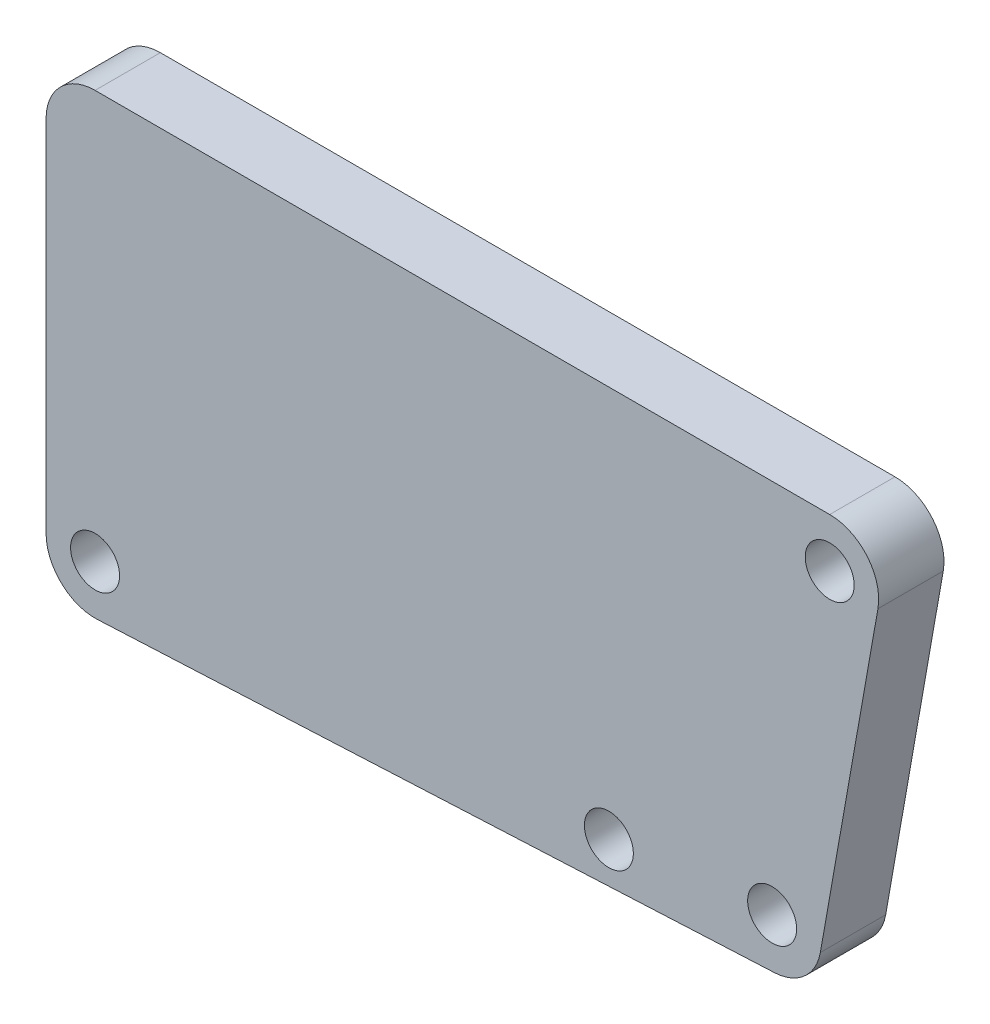
ISO-10303-21;
HEADER;
FILE_DESCRIPTION(('STEP AP214'),'2;1');
FILE_NAME('part.step','',(''),(''),'','','');
FILE_SCHEMA(('AUTOMOTIVE_DESIGN { 1 0 10303 214 1 1 1 1 }'));
ENDSEC;
DATA;
#1=APPLICATION_CONTEXT('core data for automotive mechanical design processes');
#2=APPLICATION_PROTOCOL_DEFINITION('international standard','automotive_design',2000,#1);
#3=PRODUCT_CONTEXT('',#1,'mechanical');
#4=PRODUCT('Part','Part','',(#3));
#5=PRODUCT_RELATED_PRODUCT_CATEGORY('part','',(#4));
#6=PRODUCT_DEFINITION_FORMATION('','',#4);
#7=PRODUCT_DEFINITION_CONTEXT('part definition',#1,'design');
#8=PRODUCT_DEFINITION('design','',#6,#7);
#9=PRODUCT_DEFINITION_SHAPE('','',#8);
#10=(LENGTH_UNIT() NAMED_UNIT(*) SI_UNIT(.MILLI.,.METRE.));
#11=(NAMED_UNIT(*) PLANE_ANGLE_UNIT() SI_UNIT($,.RADIAN.));
#12=(NAMED_UNIT(*) SI_UNIT($,.STERADIAN.) SOLID_ANGLE_UNIT());
#13=UNCERTAINTY_MEASURE_WITH_UNIT(LENGTH_MEASURE(1.E-05),#10,'distance_accuracy_value','');
#14=(GEOMETRIC_REPRESENTATION_CONTEXT(3) GLOBAL_UNCERTAINTY_ASSIGNED_CONTEXT((#13)) GLOBAL_UNIT_ASSIGNED_CONTEXT((#10,
#11,#12)) REPRESENTATION_CONTEXT('',''));
#15=CARTESIAN_POINT('',(0.,0.,0.));
#16=DIRECTION('',(0.,0.,1.));
#17=DIRECTION('',(1.,0.,0.));
#18=AXIS2_PLACEMENT_3D('',#15,#16,#17);
#19=CARTESIAN_POINT('',(41.4734603858306,-20.,4.));
#20=DIRECTION('',(0.,0.,-1.));
#21=DIRECTION('',(-1.,0.,0.));
#22=AXIS2_PLACEMENT_3D('',#19,#20,#21);
#23=PLANE('',#22);
#24=CARTESIAN_POINT('',(41.4734603858306,-20.,4.));
#25=DIRECTION('',(0.,0.,1.));
#26=DIRECTION('',(-1.,0.,0.));
#27=AXIS2_PLACEMENT_3D('',#24,#25,#26);
#28=CIRCLE('',#27,3.);
#29=CARTESIAN_POINT('',(41.6179632929655,-22.996517797349,4.));
#30=VERTEX_POINT('',#29);
#31=CARTESIAN_POINT('',(44.4278836448672,-20.5209445330008,4.));
#32=VERTEX_POINT('',#31);
#33=EDGE_CURVE('E145',#30,#32,#28,.T.);
#34=ORIENTED_EDGE('',*,*,#33,.T.);
#35=DIRECTION('',(0.173648177666934,0.984807753012207,0.));
#36=VECTOR('',#35,1.);
#37=CARTESIAN_POINT('',(47.9544232590366,-0.520944533000803,4.));
#38=LINE('',#37,#36);
#39=CARTESIAN_POINT('',(47.9544232590366,-0.520944533000803,4.));
#40=VERTEX_POINT('',#39);
#41=EDGE_CURVE('E93',#32,#40,#38,.T.);
#42=ORIENTED_EDGE('',*,*,#41,.T.);
#43=CARTESIAN_POINT('',(45.,0.,4.));
#44=DIRECTION('',(0.,0.,1.));
#45=DIRECTION('',(-1.,0.,0.));
#46=AXIS2_PLACEMENT_3D('',#43,#44,#45);
#47=CIRCLE('',#46,3.);
#48=CARTESIAN_POINT('',(45.,3.,4.));
#49=VERTEX_POINT('',#48);
#50=EDGE_CURVE('E160',#40,#49,#47,.T.);
#51=ORIENTED_EDGE('',*,*,#50,.T.);
#52=DIRECTION('',(-1.,0.,0.));
#53=VECTOR('',#52,1.);
#54=CARTESIAN_POINT('',(0.,3.,4.));
#55=LINE('',#54,#53);
#56=CARTESIAN_POINT('',(0.,3.,4.));
#57=VERTEX_POINT('',#56);
#58=EDGE_CURVE('E173',#49,#57,#55,.T.);
#59=ORIENTED_EDGE('',*,*,#58,.T.);
#60=CARTESIAN_POINT('',(0.,0.,4.));
#61=DIRECTION('',(0.,0.,1.));
#62=DIRECTION('',(-1.,0.,0.));
#63=AXIS2_PLACEMENT_3D('',#60,#61,#62);
#64=CIRCLE('',#63,3.);
#65=CARTESIAN_POINT('',(-3.,0.,4.));
#66=VERTEX_POINT('',#65);
#67=EDGE_CURVE('E112',#57,#66,#64,.T.);
#68=ORIENTED_EDGE('',*,*,#67,.T.);
#69=DIRECTION('',(0.,-1.,0.));
#70=VECTOR('',#69,1.);
#71=CARTESIAN_POINT('',(-3.,-22.,4.));
#72=LINE('',#71,#70);
#73=CARTESIAN_POINT('',(-3.,-22.,4.));
#74=VERTEX_POINT('',#73);
#75=EDGE_CURVE('E106',#66,#74,#72,.T.);
#76=ORIENTED_EDGE('',*,*,#75,.T.);
#77=CARTESIAN_POINT('',(0.,-22.,4.));
#78=DIRECTION('',(0.,0.,1.));
#79=DIRECTION('',(1.,0.,0.));
#80=AXIS2_PLACEMENT_3D('',#77,#78,#79);
#81=CIRCLE('',#80,3.);
#82=CARTESIAN_POINT('',(0.144502907134934,-24.996517797349,4.));
#83=VERTEX_POINT('',#82);
#84=EDGE_CURVE('E110',#74,#83,#81,.T.);
#85=ORIENTED_EDGE('',*,*,#84,.T.);
#86=DIRECTION('',(0.998839265783014,0.0481676357116451,0.));
#87=VECTOR('',#86,1.);
#88=CARTESIAN_POINT('',(41.6179632929655,-22.996517797349,4.));
#89=LINE('',#88,#87);
#90=EDGE_CURVE('E50',#83,#30,#89,.T.);
#91=ORIENTED_EDGE('',*,*,#90,.T.);
#92=EDGE_LOOP('',(#34,#42,#51,#59,#68,#76,#85,#91));
#93=FACE_BOUND('',#92,.T.);
#94=CARTESIAN_POINT('',(0.,-22.,4.));
#95=DIRECTION('',(0.,0.,1.));
#96=DIRECTION('',(1.,0.,0.));
#97=AXIS2_PLACEMENT_3D('',#94,#95,#96);
#98=CIRCLE('',#97,1.5);
#99=CARTESIAN_POINT('',(1.5,-22.,4.));
#100=VERTEX_POINT('',#99);
#101=EDGE_CURVE('E134',#100,#100,#98,.T.);
#102=ORIENTED_EDGE('',*,*,#101,.F.);
#103=EDGE_LOOP('',(#102));
#104=FACE_BOUND('',#103,.T.);
#105=CARTESIAN_POINT('',(45.,0.,4.));
#106=DIRECTION('',(0.,0.,1.));
#107=DIRECTION('',(1.,0.,0.));
#108=AXIS2_PLACEMENT_3D('',#105,#106,#107);
#109=CIRCLE('',#108,1.5);
#110=CARTESIAN_POINT('',(46.5,0.,4.));
#111=VERTEX_POINT('',#110);
#112=EDGE_CURVE('E182',#111,#111,#109,.T.);
#113=ORIENTED_EDGE('',*,*,#112,.F.);
#114=EDGE_LOOP('',(#113));
#115=FACE_BOUND('',#114,.T.);
#116=CARTESIAN_POINT('',(41.4734603858306,-20.,4.));
#117=DIRECTION('',(0.,0.,1.));
#118=DIRECTION('',(1.,0.,0.));
#119=AXIS2_PLACEMENT_3D('',#116,#117,#118);
#120=CIRCLE('',#119,1.5);
#121=CARTESIAN_POINT('',(42.9734603858306,-20.,4.));
#122=VERTEX_POINT('',#121);
#123=EDGE_CURVE('E188',#122,#122,#120,.T.);
#124=ORIENTED_EDGE('',*,*,#123,.F.);
#125=EDGE_LOOP('',(#124));
#126=FACE_BOUND('',#125,.T.);
#127=CARTESIAN_POINT('',(31.4734603858306,-21.,4.));
#128=DIRECTION('',(0.,0.,1.));
#129=DIRECTION('',(1.,0.,0.));
#130=AXIS2_PLACEMENT_3D('',#127,#128,#129);
#131=CIRCLE('',#130,1.5);
#132=CARTESIAN_POINT('',(32.9734603858306,-21.,4.));
#133=VERTEX_POINT('',#132);
#134=EDGE_CURVE('E194',#133,#133,#131,.T.);
#135=ORIENTED_EDGE('',*,*,#134,.F.);
#136=EDGE_LOOP('',(#135));
#137=FACE_BOUND('',#136,.T.);
#138=ADVANCED_FACE('F33',(#93,#104,#115,#126,#137),#23,.F.);
#139=CARTESIAN_POINT('',(41.4734603858306,-20.,0.));
#140=DIRECTION('',(0.,0.,-1.));
#141=DIRECTION('',(-1.,0.,0.));
#142=AXIS2_PLACEMENT_3D('',#139,#140,#141);
#143=PLANE('',#142);
#144=CARTESIAN_POINT('',(41.4734603858306,-20.,0.));
#145=DIRECTION('',(0.,0.,1.));
#146=DIRECTION('',(1.,0.,0.));
#147=AXIS2_PLACEMENT_3D('',#144,#145,#146);
#148=CIRCLE('',#147,1.5);
#149=CARTESIAN_POINT('',(42.9734603858306,-20.,0.));
#150=VERTEX_POINT('',#149);
#151=EDGE_CURVE('E191',#150,#150,#148,.T.);
#152=ORIENTED_EDGE('',*,*,#151,.T.);
#153=EDGE_LOOP('',(#152));
#154=FACE_BOUND('',#153,.T.);
#155=CARTESIAN_POINT('',(0.,-22.,0.));
#156=DIRECTION('',(0.,0.,1.));
#157=DIRECTION('',(1.,0.,0.));
#158=AXIS2_PLACEMENT_3D('',#155,#156,#157);
#159=CIRCLE('',#158,1.5);
#160=CARTESIAN_POINT('',(1.5,-22.,0.));
#161=VERTEX_POINT('',#160);
#162=EDGE_CURVE('E179',#161,#161,#159,.T.);
#163=ORIENTED_EDGE('',*,*,#162,.T.);
#164=EDGE_LOOP('',(#163));
#165=FACE_BOUND('',#164,.T.);
#166=CARTESIAN_POINT('',(41.4734603858306,-20.,0.));
#167=DIRECTION('',(0.,0.,1.));
#168=DIRECTION('',(-1.,0.,0.));
#169=AXIS2_PLACEMENT_3D('',#166,#167,#168);
#170=CIRCLE('',#169,3.);
#171=CARTESIAN_POINT('',(41.6179632929655,-22.996517797349,0.));
#172=VERTEX_POINT('',#171);
#173=CARTESIAN_POINT('',(44.4278836448672,-20.5209445330008,0.));
#174=VERTEX_POINT('',#173);
#175=EDGE_CURVE('E130',#172,#174,#170,.T.);
#176=ORIENTED_EDGE('',*,*,#175,.F.);
#177=DIRECTION('',(0.998839265783014,0.0481676357116451,0.));
#178=VECTOR('',#177,1.);
#179=CARTESIAN_POINT('',(41.6179632929655,-22.996517797349,0.));
#180=LINE('',#179,#178);
#181=CARTESIAN_POINT('',(0.144502907134934,-24.996517797349,0.));
#182=VERTEX_POINT('',#181);
#183=EDGE_CURVE('E85',#182,#172,#180,.T.);
#184=ORIENTED_EDGE('',*,*,#183,.F.);
#185=CARTESIAN_POINT('',(0.,-22.,0.));
#186=DIRECTION('',(0.,0.,1.));
#187=DIRECTION('',(1.,0.,0.));
#188=AXIS2_PLACEMENT_3D('',#185,#186,#187);
#189=CIRCLE('',#188,3.);
#190=CARTESIAN_POINT('',(-3.,-22.,0.));
#191=VERTEX_POINT('',#190);
#192=EDGE_CURVE('E79',#191,#182,#189,.T.);
#193=ORIENTED_EDGE('',*,*,#192,.F.);
#194=DIRECTION('',(0.,-1.,0.));
#195=VECTOR('',#194,1.);
#196=CARTESIAN_POINT('',(-3.,-22.,0.));
#197=LINE('',#196,#195);
#198=CARTESIAN_POINT('',(-3.,0.,0.));
#199=VERTEX_POINT('',#198);
#200=EDGE_CURVE('E120',#199,#191,#197,.T.);
#201=ORIENTED_EDGE('',*,*,#200,.F.);
#202=CARTESIAN_POINT('',(0.,0.,0.));
#203=DIRECTION('',(0.,0.,1.));
#204=DIRECTION('',(-1.,0.,0.));
#205=AXIS2_PLACEMENT_3D('',#202,#203,#204);
#206=CIRCLE('',#205,3.);
#207=CARTESIAN_POINT('',(0.,3.,0.));
#208=VERTEX_POINT('',#207);
#209=EDGE_CURVE('E140',#208,#199,#206,.T.);
#210=ORIENTED_EDGE('',*,*,#209,.F.);
#211=DIRECTION('',(-1.,0.,0.));
#212=VECTOR('',#211,1.);
#213=CARTESIAN_POINT('',(0.,3.,0.));
#214=LINE('',#213,#212);
#215=CARTESIAN_POINT('',(45.,3.,0.));
#216=VERTEX_POINT('',#215);
#217=EDGE_CURVE('E138',#216,#208,#214,.T.);
#218=ORIENTED_EDGE('',*,*,#217,.F.);
#219=CARTESIAN_POINT('',(45.,0.,0.));
#220=DIRECTION('',(0.,0.,1.));
#221=DIRECTION('',(-1.,0.,0.));
#222=AXIS2_PLACEMENT_3D('',#219,#220,#221);
#223=CIRCLE('',#222,3.);
#224=CARTESIAN_POINT('',(47.9544232590366,-0.520944533000803,0.));
#225=VERTEX_POINT('',#224);
#226=EDGE_CURVE('E136',#225,#216,#223,.T.);
#227=ORIENTED_EDGE('',*,*,#226,.F.);
#228=DIRECTION('',(0.173648177666934,0.984807753012207,0.));
#229=VECTOR('',#228,1.);
#230=CARTESIAN_POINT('',(47.9544232590366,-0.520944533000803,0.));
#231=LINE('',#230,#229);
#232=EDGE_CURVE('E133',#174,#225,#231,.T.);
#233=ORIENTED_EDGE('',*,*,#232,.F.);
#234=EDGE_LOOP('',(#176,#184,#193,#201,#210,#218,#227,#233));
#235=FACE_BOUND('',#234,.T.);
#236=CARTESIAN_POINT('',(45.,0.,0.));
#237=DIRECTION('',(0.,0.,1.));
#238=DIRECTION('',(1.,0.,0.));
#239=AXIS2_PLACEMENT_3D('',#236,#237,#238);
#240=CIRCLE('',#239,1.5);
#241=CARTESIAN_POINT('',(46.5,0.,0.));
#242=VERTEX_POINT('',#241);
#243=EDGE_CURVE('E185',#242,#242,#240,.T.);
#244=ORIENTED_EDGE('',*,*,#243,.T.);
#245=EDGE_LOOP('',(#244));
#246=FACE_BOUND('',#245,.T.);
#247=CARTESIAN_POINT('',(31.4734603858306,-21.,0.));
#248=DIRECTION('',(0.,0.,1.));
#249=DIRECTION('',(1.,0.,0.));
#250=AXIS2_PLACEMENT_3D('',#247,#248,#249);
#251=CIRCLE('',#250,1.5);
#252=CARTESIAN_POINT('',(32.9734603858306,-21.,0.));
#253=VERTEX_POINT('',#252);
#254=EDGE_CURVE('E197',#253,#253,#251,.T.);
#255=ORIENTED_EDGE('',*,*,#254,.T.);
#256=EDGE_LOOP('',(#255));
#257=FACE_BOUND('',#256,.T.);
#258=ADVANCED_FACE('F164',(#154,#165,#235,#246,#257),#143,.T.);
#259=CARTESIAN_POINT('',(41.4734603858306,-20.,4.));
#260=DIRECTION('',(0.,0.,-1.));
#261=DIRECTION('',(-1.,0.,0.));
#262=AXIS2_PLACEMENT_3D('',#259,#260,#261);
#263=CYLINDRICAL_SURFACE('',#262,3.);
#264=ORIENTED_EDGE('',*,*,#175,.T.);
#265=DIRECTION('',(0.,0.,-1.));
#266=VECTOR('',#265,1.);
#267=CARTESIAN_POINT('',(44.4278836448672,-20.5209445330008,4.));
#268=LINE('',#267,#266);
#269=EDGE_CURVE('E11',#32,#174,#268,.T.);
#270=ORIENTED_EDGE('',*,*,#269,.F.);
#271=ORIENTED_EDGE('',*,*,#33,.F.);
#272=DIRECTION('',(0.,0.,-1.));
#273=VECTOR('',#272,1.);
#274=CARTESIAN_POINT('',(41.6179632929655,-22.996517797349,4.));
#275=LINE('',#274,#273);
#276=EDGE_CURVE('E126',#30,#172,#275,.T.);
#277=ORIENTED_EDGE('',*,*,#276,.T.);
#278=EDGE_LOOP('',(#264,#270,#271,#277));
#279=FACE_BOUND('',#278,.T.);
#280=ADVANCED_FACE('F35',(#279),#263,.T.);
#281=CARTESIAN_POINT('',(47.9544232590366,-0.520944533000803,4.));
#282=DIRECTION('',(-0.984807753012207,0.173648177666934,0.));
#283=DIRECTION('',(-0.173648177666934,-0.984807753012208,0.));
#284=AXIS2_PLACEMENT_3D('',#281,#282,#283);
#285=PLANE('',#284);
#286=ORIENTED_EDGE('',*,*,#232,.T.);
#287=DIRECTION('',(0.,0.,-1.));
#288=VECTOR('',#287,1.);
#289=CARTESIAN_POINT('',(47.9544232590366,-0.520944533000803,4.));
#290=LINE('',#289,#288);
#291=EDGE_CURVE('E42',#40,#225,#290,.T.);
#292=ORIENTED_EDGE('',*,*,#291,.F.);
#293=ORIENTED_EDGE('',*,*,#41,.F.);
#294=ORIENTED_EDGE('',*,*,#269,.T.);
#295=EDGE_LOOP('',(#286,#292,#293,#294));
#296=FACE_BOUND('',#295,.T.);
#297=ADVANCED_FACE('F229',(#296),#285,.F.);
#298=CARTESIAN_POINT('',(45.,0.,4.));
#299=DIRECTION('',(0.,0.,-1.));
#300=DIRECTION('',(-1.,0.,0.));
#301=AXIS2_PLACEMENT_3D('',#298,#299,#300);
#302=CYLINDRICAL_SURFACE('',#301,3.);
#303=ORIENTED_EDGE('',*,*,#226,.T.);
#304=DIRECTION('',(0.,0.,-1.));
#305=VECTOR('',#304,1.);
#306=CARTESIAN_POINT('',(45.,3.,4.));
#307=LINE('',#306,#305);
#308=EDGE_CURVE('E152',#49,#216,#307,.T.);
#309=ORIENTED_EDGE('',*,*,#308,.F.);
#310=ORIENTED_EDGE('',*,*,#50,.F.);
#311=ORIENTED_EDGE('',*,*,#291,.T.);
#312=EDGE_LOOP('',(#303,#309,#310,#311));
#313=FACE_BOUND('',#312,.T.);
#314=ADVANCED_FACE('F158',(#313),#302,.T.);
#315=CARTESIAN_POINT('',(0.,3.,4.));
#316=DIRECTION('',(0.,-1.,0.));
#317=DIRECTION('',(0.,0.,-1.));
#318=AXIS2_PLACEMENT_3D('',#315,#316,#317);
#319=PLANE('',#318);
#320=ORIENTED_EDGE('',*,*,#217,.T.);
#321=DIRECTION('',(0.,0.,-1.));
#322=VECTOR('',#321,1.);
#323=CARTESIAN_POINT('',(0.,3.,4.));
#324=LINE('',#323,#322);
#325=EDGE_CURVE('E149',#57,#208,#324,.T.);
#326=ORIENTED_EDGE('',*,*,#325,.F.);
#327=ORIENTED_EDGE('',*,*,#58,.F.);
#328=ORIENTED_EDGE('',*,*,#308,.T.);
#329=EDGE_LOOP('',(#320,#326,#327,#328));
#330=FACE_BOUND('',#329,.T.);
#331=ADVANCED_FACE('F169',(#330),#319,.F.);
#332=CARTESIAN_POINT('',(0.,0.,4.));
#333=DIRECTION('',(0.,0.,-1.));
#334=DIRECTION('',(-1.,0.,0.));
#335=AXIS2_PLACEMENT_3D('',#332,#333,#334);
#336=CYLINDRICAL_SURFACE('',#335,3.);
#337=ORIENTED_EDGE('',*,*,#209,.T.);
#338=DIRECTION('',(0.,0.,-1.));
#339=VECTOR('',#338,1.);
#340=CARTESIAN_POINT('',(-3.,0.,4.));
#341=LINE('',#340,#339);
#342=EDGE_CURVE('E121',#66,#199,#341,.T.);
#343=ORIENTED_EDGE('',*,*,#342,.F.);
#344=ORIENTED_EDGE('',*,*,#67,.F.);
#345=ORIENTED_EDGE('',*,*,#325,.T.);
#346=EDGE_LOOP('',(#337,#343,#344,#345));
#347=FACE_BOUND('',#346,.T.);
#348=ADVANCED_FACE('F172',(#347),#336,.T.);
#349=CARTESIAN_POINT('',(-3.,-22.,4.));
#350=DIRECTION('',(1.,0.,0.));
#351=DIRECTION('',(0.,1.,0.));
#352=AXIS2_PLACEMENT_3D('',#349,#350,#351);
#353=PLANE('',#352);
#354=ORIENTED_EDGE('',*,*,#200,.T.);
#355=DIRECTION('',(0.,0.,-1.));
#356=VECTOR('',#355,1.);
#357=CARTESIAN_POINT('',(-3.,-22.,4.));
#358=LINE('',#357,#356);
#359=EDGE_CURVE('E117',#74,#191,#358,.T.);
#360=ORIENTED_EDGE('',*,*,#359,.F.);
#361=ORIENTED_EDGE('',*,*,#75,.F.);
#362=ORIENTED_EDGE('',*,*,#342,.T.);
#363=EDGE_LOOP('',(#354,#360,#361,#362));
#364=FACE_BOUND('',#363,.T.);
#365=ADVANCED_FACE('F118',(#364),#353,.F.);
#366=CARTESIAN_POINT('',(0.,-22.,4.));
#367=DIRECTION('',(0.,0.,-1.));
#368=DIRECTION('',(-1.,0.,0.));
#369=AXIS2_PLACEMENT_3D('',#366,#367,#368);
#370=CYLINDRICAL_SURFACE('',#369,3.);
#371=ORIENTED_EDGE('',*,*,#192,.T.);
#372=DIRECTION('',(0.,0.,-1.));
#373=VECTOR('',#372,1.);
#374=CARTESIAN_POINT('',(0.144502907134934,-24.996517797349,4.));
#375=LINE('',#374,#373);
#376=EDGE_CURVE('E122',#83,#182,#375,.T.);
#377=ORIENTED_EDGE('',*,*,#376,.F.);
#378=ORIENTED_EDGE('',*,*,#84,.F.);
#379=ORIENTED_EDGE('',*,*,#359,.T.);
#380=EDGE_LOOP('',(#371,#377,#378,#379));
#381=FACE_BOUND('',#380,.T.);
#382=ADVANCED_FACE('F124',(#381),#370,.T.);
#383=CARTESIAN_POINT('',(41.6179632929655,-22.996517797349,4.));
#384=DIRECTION('',(-0.0481676357116451,0.998839265783014,0.));
#385=DIRECTION('',(-0.998839265783014,-0.0481676357116451,0.));
#386=AXIS2_PLACEMENT_3D('',#383,#384,#385);
#387=PLANE('',#386);
#388=ORIENTED_EDGE('',*,*,#183,.T.);
#389=ORIENTED_EDGE('',*,*,#276,.F.);
#390=ORIENTED_EDGE('',*,*,#90,.F.);
#391=ORIENTED_EDGE('',*,*,#376,.T.);
#392=EDGE_LOOP('',(#388,#389,#390,#391));
#393=FACE_BOUND('',#392,.T.);
#394=ADVANCED_FACE('F217',(#393),#387,.F.);
#395=CARTESIAN_POINT('',(0.,-22.,4.));
#396=DIRECTION('',(0.,0.,-1.));
#397=DIRECTION('',(-1.,0.,0.));
#398=AXIS2_PLACEMENT_3D('',#395,#396,#397);
#399=CYLINDRICAL_SURFACE('',#398,1.5);
#400=ORIENTED_EDGE('',*,*,#101,.T.);
#401=EDGE_LOOP('',(#400));
#402=FACE_BOUND('',#401,.T.);
#403=ORIENTED_EDGE('',*,*,#162,.F.);
#404=EDGE_LOOP('',(#403));
#405=FACE_BOUND('',#404,.T.);
#406=ADVANCED_FACE('F214',(#402,#405),#399,.F.);
#407=CARTESIAN_POINT('',(45.,0.,4.));
#408=DIRECTION('',(0.,0.,-1.));
#409=DIRECTION('',(-1.,0.,0.));
#410=AXIS2_PLACEMENT_3D('',#407,#408,#409);
#411=CYLINDRICAL_SURFACE('',#410,1.5);
#412=ORIENTED_EDGE('',*,*,#112,.T.);
#413=EDGE_LOOP('',(#412));
#414=FACE_BOUND('',#413,.T.);
#415=ORIENTED_EDGE('',*,*,#243,.F.);
#416=EDGE_LOOP('',(#415));
#417=FACE_BOUND('',#416,.T.);
#418=ADVANCED_FACE('F293',(#414,#417),#411,.F.);
#419=CARTESIAN_POINT('',(41.4734603858306,-20.,4.));
#420=DIRECTION('',(0.,0.,-1.));
#421=DIRECTION('',(-1.,0.,0.));
#422=AXIS2_PLACEMENT_3D('',#419,#420,#421);
#423=CYLINDRICAL_SURFACE('',#422,1.5);
#424=ORIENTED_EDGE('',*,*,#123,.T.);
#425=EDGE_LOOP('',(#424));
#426=FACE_BOUND('',#425,.T.);
#427=ORIENTED_EDGE('',*,*,#151,.F.);
#428=EDGE_LOOP('',(#427));
#429=FACE_BOUND('',#428,.T.);
#430=ADVANCED_FACE('F301',(#426,#429),#423,.F.);
#431=CARTESIAN_POINT('',(31.4734603858306,-21.,4.));
#432=DIRECTION('',(0.,0.,-1.));
#433=DIRECTION('',(-1.,0.,0.));
#434=AXIS2_PLACEMENT_3D('',#431,#432,#433);
#435=CYLINDRICAL_SURFACE('',#434,1.5);
#436=ORIENTED_EDGE('',*,*,#134,.T.);
#437=EDGE_LOOP('',(#436));
#438=FACE_BOUND('',#437,.T.);
#439=ORIENTED_EDGE('',*,*,#254,.F.);
#440=EDGE_LOOP('',(#439));
#441=FACE_BOUND('',#440,.T.);
#442=ADVANCED_FACE('F203',(#438,#441),#435,.F.);
#443=CLOSED_SHELL('',(#138,#258,#280,#297,#314,#331,#348,#365,#382,#394,#406,#418,#430,#442));
#444=MANIFOLD_SOLID_BREP('B2',#443);
#445=ADVANCED_BREP_SHAPE_REPRESENTATION('',(#18,#444),#14);
#446=SHAPE_DEFINITION_REPRESENTATION(#9,#445);
ENDSEC;
END-ISO-10303-21;
